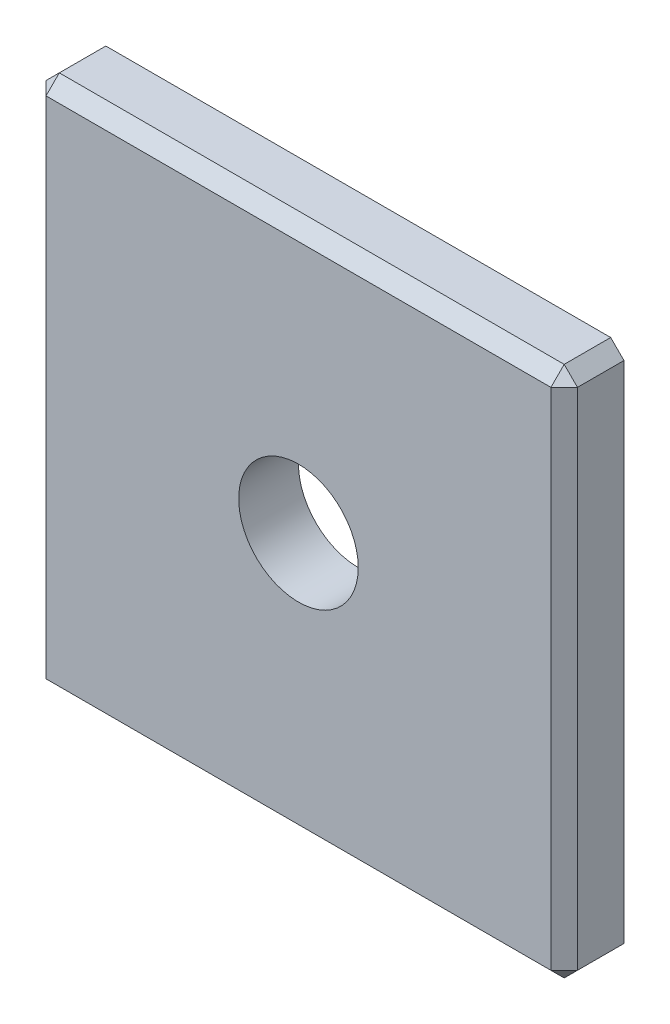
ISO-10303-21;
HEADER;
FILE_DESCRIPTION(('STEP AP214'),'2;1');
FILE_NAME('part.step','',(''),(''),'','','');
FILE_SCHEMA(('AUTOMOTIVE_DESIGN { 1 0 10303 214 1 1 1 1 }'));
ENDSEC;
DATA;
#1=APPLICATION_CONTEXT('core data for automotive mechanical design processes');
#2=APPLICATION_PROTOCOL_DEFINITION('international standard','automotive_design',2000,#1);
#3=PRODUCT_CONTEXT('',#1,'mechanical');
#4=PRODUCT('Part','Part','',(#3));
#5=PRODUCT_RELATED_PRODUCT_CATEGORY('part','',(#4));
#6=PRODUCT_DEFINITION_FORMATION('','',#4);
#7=PRODUCT_DEFINITION_CONTEXT('part definition',#1,'design');
#8=PRODUCT_DEFINITION('design','',#6,#7);
#9=PRODUCT_DEFINITION_SHAPE('','',#8);
#10=(LENGTH_UNIT() NAMED_UNIT(*) SI_UNIT(.MILLI.,.METRE.));
#11=(NAMED_UNIT(*) PLANE_ANGLE_UNIT() SI_UNIT($,.RADIAN.));
#12=(NAMED_UNIT(*) SI_UNIT($,.STERADIAN.) SOLID_ANGLE_UNIT());
#13=UNCERTAINTY_MEASURE_WITH_UNIT(LENGTH_MEASURE(1.E-05),#10,'distance_accuracy_value','');
#14=(GEOMETRIC_REPRESENTATION_CONTEXT(3) GLOBAL_UNCERTAINTY_ASSIGNED_CONTEXT((#13)) GLOBAL_UNIT_ASSIGNED_CONTEXT((#10,
#11,#12)) REPRESENTATION_CONTEXT('',''));
#15=CARTESIAN_POINT('',(0.,0.,0.));
#16=DIRECTION('',(0.,0.,1.));
#17=DIRECTION('',(1.,0.,0.));
#18=AXIS2_PLACEMENT_3D('',#15,#16,#17);
#19=CARTESIAN_POINT('',(0.,0.,4.5));
#20=DIRECTION('',(0.,0.,-1.));
#21=DIRECTION('',(-1.,0.,0.));
#22=AXIS2_PLACEMENT_3D('',#19,#20,#21);
#23=PLANE('',#22);
#24=DIRECTION('',(0.,-1.,0.));
#25=VECTOR('',#24,1.);
#26=CARTESIAN_POINT('',(-19.,0.,4.5));
#27=LINE('',#26,#25);
#28=CARTESIAN_POINT('',(-19.,19.,4.5));
#29=VERTEX_POINT('',#28);
#30=CARTESIAN_POINT('',(-19.,-19.,4.5));
#31=VERTEX_POINT('',#30);
#32=EDGE_CURVE('E116',#29,#31,#27,.T.);
#33=ORIENTED_EDGE('',*,*,#32,.T.);
#34=DIRECTION('',(1.,0.,0.));
#35=VECTOR('',#34,1.);
#36=CARTESIAN_POINT('',(0.,-19.,4.5));
#37=LINE('',#36,#35);
#38=CARTESIAN_POINT('',(19.,-19.,4.5));
#39=VERTEX_POINT('',#38);
#40=EDGE_CURVE('E153',#31,#39,#37,.T.);
#41=ORIENTED_EDGE('',*,*,#40,.T.);
#42=DIRECTION('',(0.,1.,0.));
#43=VECTOR('',#42,1.);
#44=CARTESIAN_POINT('',(19.,0.,4.5));
#45=LINE('',#44,#43);
#46=CARTESIAN_POINT('',(19.,19.,4.5));
#47=VERTEX_POINT('',#46);
#48=EDGE_CURVE('E119',#39,#47,#45,.T.);
#49=ORIENTED_EDGE('',*,*,#48,.T.);
#50=DIRECTION('',(-1.,0.,0.));
#51=VECTOR('',#50,1.);
#52=CARTESIAN_POINT('',(0.,19.,4.5));
#53=LINE('',#52,#51);
#54=EDGE_CURVE('E111',#47,#29,#53,.T.);
#55=ORIENTED_EDGE('',*,*,#54,.T.);
#56=EDGE_LOOP('',(#33,#41,#49,#55));
#57=FACE_BOUND('',#56,.T.);
#58=CARTESIAN_POINT('',(0.,0.,4.5));
#59=DIRECTION('',(0.,0.,1.));
#60=DIRECTION('',(1.,0.,0.));
#61=AXIS2_PLACEMENT_3D('',#58,#59,#60);
#62=CIRCLE('',#61,4.5);
#63=CARTESIAN_POINT('',(4.5,0.,4.5));
#64=VERTEX_POINT('',#63);
#65=EDGE_CURVE('E241',#64,#64,#62,.T.);
#66=ORIENTED_EDGE('',*,*,#65,.F.);
#67=EDGE_LOOP('',(#66));
#68=FACE_BOUND('',#67,.T.);
#69=ADVANCED_FACE('F35',(#57,#68),#23,.F.);
#70=CARTESIAN_POINT('',(0.,0.,0.));
#71=DIRECTION('',(0.,0.,-1.));
#72=DIRECTION('',(-1.,0.,0.));
#73=AXIS2_PLACEMENT_3D('',#70,#71,#72);
#74=PLANE('',#73);
#75=DIRECTION('',(0.,1.,0.));
#76=VECTOR('',#75,1.);
#77=CARTESIAN_POINT('',(20.,-20.,0.));
#78=LINE('',#77,#76);
#79=CARTESIAN_POINT('',(20.,-19.,0.));
#80=VERTEX_POINT('',#79);
#81=CARTESIAN_POINT('',(20.,19.,0.));
#82=VERTEX_POINT('',#81);
#83=EDGE_CURVE('E226',#80,#82,#78,.T.);
#84=ORIENTED_EDGE('',*,*,#83,.F.);
#85=DIRECTION('',(0.707106781186545,0.70710678118655,0.));
#86=VECTOR('',#85,1.);
#87=CARTESIAN_POINT('',(19.5000000000001,-19.4999999999999,0.));
#88=LINE('',#87,#86);
#89=CARTESIAN_POINT('',(19.,-20.,0.));
#90=VERTEX_POINT('',#89);
#91=EDGE_CURVE('E174',#80,#90,#88,.F.);
#92=ORIENTED_EDGE('',*,*,#91,.T.);
#93=DIRECTION('',(1.,0.,0.));
#94=VECTOR('',#93,1.);
#95=CARTESIAN_POINT('',(-20.,-20.,0.));
#96=LINE('',#95,#94);
#97=CARTESIAN_POINT('',(-19.,-20.,0.));
#98=VERTEX_POINT('',#97);
#99=EDGE_CURVE('E145',#98,#90,#96,.T.);
#100=ORIENTED_EDGE('',*,*,#99,.F.);
#101=DIRECTION('',(0.707106781186545,-0.70710678118655,0.));
#102=VECTOR('',#101,1.);
#103=CARTESIAN_POINT('',(-19.5000000000001,-19.4999999999999,0.));
#104=LINE('',#103,#102);
#105=CARTESIAN_POINT('',(-20.,-19.,0.));
#106=VERTEX_POINT('',#105);
#107=EDGE_CURVE('E168',#98,#106,#104,.F.);
#108=ORIENTED_EDGE('',*,*,#107,.T.);
#109=DIRECTION('',(0.,-1.,0.));
#110=VECTOR('',#109,1.);
#111=CARTESIAN_POINT('',(-20.,-20.,0.));
#112=LINE('',#111,#110);
#113=CARTESIAN_POINT('',(-20.,19.,0.));
#114=VERTEX_POINT('',#113);
#115=EDGE_CURVE('E148',#114,#106,#112,.T.);
#116=ORIENTED_EDGE('',*,*,#115,.F.);
#117=DIRECTION('',(-0.707106781186545,-0.70710678118655,0.));
#118=VECTOR('',#117,1.);
#119=CARTESIAN_POINT('',(-19.5000000000001,19.4999999999999,0.));
#120=LINE('',#119,#118);
#121=CARTESIAN_POINT('',(-19.,20.,0.));
#122=VERTEX_POINT('',#121);
#123=EDGE_CURVE('E170',#114,#122,#120,.F.);
#124=ORIENTED_EDGE('',*,*,#123,.T.);
#125=DIRECTION('',(-1.,0.,0.));
#126=VECTOR('',#125,1.);
#127=CARTESIAN_POINT('',(-20.,20.,0.));
#128=LINE('',#127,#126);
#129=CARTESIAN_POINT('',(19.,20.,0.));
#130=VERTEX_POINT('',#129);
#131=EDGE_CURVE('E236',#130,#122,#128,.T.);
#132=ORIENTED_EDGE('',*,*,#131,.F.);
#133=DIRECTION('',(-0.707106781186545,0.70710678118655,0.));
#134=VECTOR('',#133,1.);
#135=CARTESIAN_POINT('',(19.5000000000001,19.4999999999999,0.));
#136=LINE('',#135,#134);
#137=EDGE_CURVE('E172',#130,#82,#136,.F.);
#138=ORIENTED_EDGE('',*,*,#137,.T.);
#139=EDGE_LOOP('',(#84,#92,#100,#108,#116,#124,#132,#138));
#140=FACE_BOUND('',#139,.T.);
#141=CARTESIAN_POINT('',(0.,0.,0.));
#142=DIRECTION('',(0.,0.,1.));
#143=DIRECTION('',(1.,0.,0.));
#144=AXIS2_PLACEMENT_3D('',#141,#142,#143);
#145=CIRCLE('',#144,4.5);
#146=CARTESIAN_POINT('',(4.5,0.,0.));
#147=VERTEX_POINT('',#146);
#148=EDGE_CURVE('E242',#147,#147,#145,.T.);
#149=ORIENTED_EDGE('',*,*,#148,.T.);
#150=EDGE_LOOP('',(#149));
#151=FACE_BOUND('',#150,.T.);
#152=ADVANCED_FACE('F223',(#140,#151),#74,.T.);
#153=CARTESIAN_POINT('',(20.,-20.,4.5));
#154=DIRECTION('',(-1.,0.,0.));
#155=DIRECTION('',(0.,0.,1.));
#156=AXIS2_PLACEMENT_3D('',#153,#154,#155);
#157=PLANE('',#156);
#158=DIRECTION('',(0.,-1.,0.));
#159=VECTOR('',#158,1.);
#160=CARTESIAN_POINT('',(20.,-20.,3.49999999999999));
#161=LINE('',#160,#159);
#162=CARTESIAN_POINT('',(20.,19.,3.49999999999999));
#163=VERTEX_POINT('',#162);
#164=CARTESIAN_POINT('',(20.,-19.,3.49999999999999));
#165=VERTEX_POINT('',#164);
#166=EDGE_CURVE('E164',#163,#165,#161,.T.);
#167=ORIENTED_EDGE('',*,*,#166,.T.);
#168=DIRECTION('',(0.,0.,-1.));
#169=VECTOR('',#168,1.);
#170=CARTESIAN_POINT('',(20.,-19.,4.5));
#171=LINE('',#170,#169);
#172=EDGE_CURVE('E166',#165,#80,#171,.T.);
#173=ORIENTED_EDGE('',*,*,#172,.T.);
#174=ORIENTED_EDGE('',*,*,#83,.T.);
#175=DIRECTION('',(0.,0.,1.));
#176=VECTOR('',#175,1.);
#177=CARTESIAN_POINT('',(20.,19.,4.5));
#178=LINE('',#177,#176);
#179=EDGE_CURVE('E162',#82,#163,#178,.T.);
#180=ORIENTED_EDGE('',*,*,#179,.T.);
#181=EDGE_LOOP('',(#167,#173,#174,#180));
#182=FACE_BOUND('',#181,.T.);
#183=ADVANCED_FACE('F211',(#182),#157,.F.);
#184=CARTESIAN_POINT('',(-20.,20.,4.5));
#185=DIRECTION('',(0.,-1.,0.));
#186=DIRECTION('',(0.,0.,-1.));
#187=AXIS2_PLACEMENT_3D('',#184,#185,#186);
#188=PLANE('',#187);
#189=DIRECTION('',(1.,0.,0.));
#190=VECTOR('',#189,1.);
#191=CARTESIAN_POINT('',(-20.,20.,3.49999999999999));
#192=LINE('',#191,#190);
#193=CARTESIAN_POINT('',(-19.,20.,3.49999999999999));
#194=VERTEX_POINT('',#193);
#195=CARTESIAN_POINT('',(19.,20.,3.49999999999999));
#196=VERTEX_POINT('',#195);
#197=EDGE_CURVE('E129',#194,#196,#192,.T.);
#198=ORIENTED_EDGE('',*,*,#197,.T.);
#199=DIRECTION('',(0.,0.,-1.));
#200=VECTOR('',#199,1.);
#201=CARTESIAN_POINT('',(19.,20.,4.5));
#202=LINE('',#201,#200);
#203=EDGE_CURVE('E179',#196,#130,#202,.T.);
#204=ORIENTED_EDGE('',*,*,#203,.T.);
#205=ORIENTED_EDGE('',*,*,#131,.T.);
#206=DIRECTION('',(0.,0.,1.));
#207=VECTOR('',#206,1.);
#208=CARTESIAN_POINT('',(-19.,20.,4.5));
#209=LINE('',#208,#207);
#210=EDGE_CURVE('E176',#122,#194,#209,.T.);
#211=ORIENTED_EDGE('',*,*,#210,.T.);
#212=EDGE_LOOP('',(#198,#204,#205,#211));
#213=FACE_BOUND('',#212,.T.);
#214=ADVANCED_FACE('F262',(#213),#188,.F.);
#215=CARTESIAN_POINT('',(-20.,-20.,4.5));
#216=DIRECTION('',(1.,0.,0.));
#217=DIRECTION('',(0.,0.,-1.));
#218=AXIS2_PLACEMENT_3D('',#215,#216,#217);
#219=PLANE('',#218);
#220=DIRECTION('',(0.,1.,0.));
#221=VECTOR('',#220,1.);
#222=CARTESIAN_POINT('',(-20.,-20.,3.49999999999999));
#223=LINE('',#222,#221);
#224=CARTESIAN_POINT('',(-20.,-19.,3.49999999999999));
#225=VERTEX_POINT('',#224);
#226=CARTESIAN_POINT('',(-20.,19.,3.49999999999999));
#227=VERTEX_POINT('',#226);
#228=EDGE_CURVE('E45',#225,#227,#223,.T.);
#229=ORIENTED_EDGE('',*,*,#228,.T.);
#230=DIRECTION('',(0.,0.,-1.));
#231=VECTOR('',#230,1.);
#232=CARTESIAN_POINT('',(-20.,19.,4.5));
#233=LINE('',#232,#231);
#234=EDGE_CURVE('E11',#227,#114,#233,.T.);
#235=ORIENTED_EDGE('',*,*,#234,.T.);
#236=ORIENTED_EDGE('',*,*,#115,.T.);
#237=DIRECTION('',(0.,0.,1.));
#238=VECTOR('',#237,1.);
#239=CARTESIAN_POINT('',(-20.,-19.,4.5));
#240=LINE('',#239,#238);
#241=EDGE_CURVE('E56',#106,#225,#240,.T.);
#242=ORIENTED_EDGE('',*,*,#241,.T.);
#243=EDGE_LOOP('',(#229,#235,#236,#242));
#244=FACE_BOUND('',#243,.T.);
#245=ADVANCED_FACE('F235',(#244),#219,.F.);
#246=CARTESIAN_POINT('',(-20.,-20.,4.5));
#247=DIRECTION('',(0.,1.,0.));
#248=DIRECTION('',(0.,0.,1.));
#249=AXIS2_PLACEMENT_3D('',#246,#247,#248);
#250=PLANE('',#249);
#251=ORIENTED_EDGE('',*,*,#99,.T.);
#252=DIRECTION('',(0.,0.,1.));
#253=VECTOR('',#252,1.);
#254=CARTESIAN_POINT('',(19.,-20.,4.5));
#255=LINE('',#254,#253);
#256=CARTESIAN_POINT('',(19.,-20.,3.5));
#257=VERTEX_POINT('',#256);
#258=EDGE_CURVE('E160',#90,#257,#255,.T.);
#259=ORIENTED_EDGE('',*,*,#258,.T.);
#260=DIRECTION('',(-1.,0.,0.));
#261=VECTOR('',#260,1.);
#262=CARTESIAN_POINT('',(-20.,-20.,3.5));
#263=LINE('',#262,#261);
#264=CARTESIAN_POINT('',(-19.,-20.,3.5));
#265=VERTEX_POINT('',#264);
#266=EDGE_CURVE('E157',#257,#265,#263,.T.);
#267=ORIENTED_EDGE('',*,*,#266,.T.);
#268=DIRECTION('',(0.,0.,-1.));
#269=VECTOR('',#268,1.);
#270=CARTESIAN_POINT('',(-19.,-20.,4.5));
#271=LINE('',#270,#269);
#272=EDGE_CURVE('E155',#265,#98,#271,.T.);
#273=ORIENTED_EDGE('',*,*,#272,.T.);
#274=EDGE_LOOP('',(#251,#259,#267,#273));
#275=FACE_BOUND('',#274,.T.);
#276=ADVANCED_FACE('F228',(#275),#250,.F.);
#277=CARTESIAN_POINT('',(0.,0.,4.5));
#278=DIRECTION('',(0.,0.,-1.));
#279=DIRECTION('',(-1.,0.,0.));
#280=AXIS2_PLACEMENT_3D('',#277,#278,#279);
#281=CYLINDRICAL_SURFACE('',#280,4.5);
#282=ORIENTED_EDGE('',*,*,#65,.T.);
#283=EDGE_LOOP('',(#282));
#284=FACE_BOUND('',#283,.T.);
#285=ORIENTED_EDGE('',*,*,#148,.F.);
#286=EDGE_LOOP('',(#285));
#287=FACE_BOUND('',#286,.T.);
#288=ADVANCED_FACE('F248',(#284,#287),#281,.F.);
#289=CARTESIAN_POINT('',(-20.,19.,4.5));
#290=DIRECTION('',(0.70710678118655,-0.707106781186545,0.));
#291=DIRECTION('',(0.,0.,-1.));
#292=AXIS2_PLACEMENT_3D('',#289,#290,#291);
#293=PLANE('',#292);
#294=ORIENTED_EDGE('',*,*,#123,.F.);
#295=ORIENTED_EDGE('',*,*,#234,.F.);
#296=DIRECTION('',(0.707106781186545,0.70710678118655,0.));
#297=VECTOR('',#296,1.);
#298=CARTESIAN_POINT('',(-19.5,19.5,3.49999999999999));
#299=LINE('',#298,#297);
#300=EDGE_CURVE('E40',#194,#227,#299,.F.);
#301=ORIENTED_EDGE('',*,*,#300,.F.);
#302=ORIENTED_EDGE('',*,*,#210,.F.);
#303=EDGE_LOOP('',(#294,#295,#301,#302));
#304=FACE_BOUND('',#303,.T.);
#305=ADVANCED_FACE('F38',(#304),#293,.F.);
#306=CARTESIAN_POINT('',(0.,19.,4.5));
#307=DIRECTION('',(0.,-0.70710678118655,-0.707106781186545));
#308=DIRECTION('',(-1.,0.,0.));
#309=AXIS2_PLACEMENT_3D('',#306,#307,#308);
#310=PLANE('',#309);
#311=DIRECTION('',(0.,0.707106781186545,-0.70710678118655));
#312=VECTOR('',#311,1.);
#313=CARTESIAN_POINT('',(19.,19.,4.5));
#314=LINE('',#313,#312);
#315=EDGE_CURVE('E133',#196,#47,#314,.F.);
#316=ORIENTED_EDGE('',*,*,#315,.F.);
#317=ORIENTED_EDGE('',*,*,#197,.F.);
#318=DIRECTION('',(0.,-0.707106781186545,0.70710678118655));
#319=VECTOR('',#318,1.);
#320=CARTESIAN_POINT('',(-19.,19.,4.5));
#321=LINE('',#320,#319);
#322=EDGE_CURVE('E126',#29,#194,#321,.F.);
#323=ORIENTED_EDGE('',*,*,#322,.F.);
#324=ORIENTED_EDGE('',*,*,#54,.F.);
#325=EDGE_LOOP('',(#316,#317,#323,#324));
#326=FACE_BOUND('',#325,.T.);
#327=ADVANCED_FACE('F128',(#326),#310,.F.);
#328=CARTESIAN_POINT('',(19.,20.,4.5));
#329=DIRECTION('',(-0.70710678118655,-0.707106781186545,0.));
#330=DIRECTION('',(0.,0.,-1.));
#331=AXIS2_PLACEMENT_3D('',#328,#329,#330);
#332=PLANE('',#331);
#333=ORIENTED_EDGE('',*,*,#137,.F.);
#334=ORIENTED_EDGE('',*,*,#203,.F.);
#335=DIRECTION('',(0.707106781186545,-0.70710678118655,0.));
#336=VECTOR('',#335,1.);
#337=CARTESIAN_POINT('',(19.5,19.5,3.49999999999999));
#338=LINE('',#337,#336);
#339=EDGE_CURVE('E138',#163,#196,#338,.F.);
#340=ORIENTED_EDGE('',*,*,#339,.F.);
#341=ORIENTED_EDGE('',*,*,#179,.F.);
#342=EDGE_LOOP('',(#333,#334,#340,#341));
#343=FACE_BOUND('',#342,.T.);
#344=ADVANCED_FACE('F320',(#343),#332,.F.);
#345=CARTESIAN_POINT('',(-19.,19.,4.5));
#346=DIRECTION('',(-0.57735026918963,0.577350269189626,0.577350269189622));
#347=DIRECTION('',(-0.707106781186545,-0.70710678118655,0.));
#348=AXIS2_PLACEMENT_3D('',#345,#346,#347);
#349=PLANE('',#348);
#350=ORIENTED_EDGE('',*,*,#322,.T.);
#351=ORIENTED_EDGE('',*,*,#300,.T.);
#352=DIRECTION('',(-0.707106781186545,0.,-0.70710678118655));
#353=VECTOR('',#352,1.);
#354=CARTESIAN_POINT('',(-19.,19.,4.5));
#355=LINE('',#354,#353);
#356=EDGE_CURVE('E135',#29,#227,#355,.T.);
#357=ORIENTED_EDGE('',*,*,#356,.F.);
#358=EDGE_LOOP('',(#350,#351,#357));
#359=FACE_BOUND('',#358,.T.);
#360=ADVANCED_FACE('F136',(#359),#349,.T.);
#361=CARTESIAN_POINT('',(19.,19.,4.5));
#362=DIRECTION('',(0.57735026918963,0.577350269189626,0.577350269189622));
#363=DIRECTION('',(-0.707106781186545,0.70710678118655,0.));
#364=AXIS2_PLACEMENT_3D('',#361,#362,#363);
#365=PLANE('',#364);
#366=ORIENTED_EDGE('',*,*,#339,.T.);
#367=ORIENTED_EDGE('',*,*,#315,.T.);
#368=DIRECTION('',(-0.707106781186545,0.,0.70710678118655));
#369=VECTOR('',#368,1.);
#370=CARTESIAN_POINT('',(19.,19.,4.5));
#371=LINE('',#370,#369);
#372=EDGE_CURVE('E139',#163,#47,#371,.T.);
#373=ORIENTED_EDGE('',*,*,#372,.F.);
#374=EDGE_LOOP('',(#366,#367,#373));
#375=FACE_BOUND('',#374,.T.);
#376=ADVANCED_FACE('F203',(#375),#365,.T.);
#377=CARTESIAN_POINT('',(-19.,-20.,4.5));
#378=DIRECTION('',(0.70710678118655,0.707106781186545,0.));
#379=DIRECTION('',(0.,0.,-1.));
#380=AXIS2_PLACEMENT_3D('',#377,#378,#379);
#381=PLANE('',#380);
#382=ORIENTED_EDGE('',*,*,#107,.F.);
#383=ORIENTED_EDGE('',*,*,#272,.F.);
#384=DIRECTION('',(-0.707106781186545,0.70710678118655,0.));
#385=VECTOR('',#384,1.);
#386=CARTESIAN_POINT('',(-19.,-20.,3.5));
#387=LINE('',#386,#385);
#388=EDGE_CURVE('E194',#225,#265,#387,.F.);
#389=ORIENTED_EDGE('',*,*,#388,.F.);
#390=ORIENTED_EDGE('',*,*,#241,.F.);
#391=EDGE_LOOP('',(#382,#383,#389,#390));
#392=FACE_BOUND('',#391,.T.);
#393=ADVANCED_FACE('F232',(#392),#381,.F.);
#394=CARTESIAN_POINT('',(-19.,0.,4.5));
#395=DIRECTION('',(0.70710678118655,0.,-0.707106781186545));
#396=DIRECTION('',(0.,-1.,0.));
#397=AXIS2_PLACEMENT_3D('',#394,#395,#396);
#398=PLANE('',#397);
#399=ORIENTED_EDGE('',*,*,#356,.T.);
#400=ORIENTED_EDGE('',*,*,#228,.F.);
#401=DIRECTION('',(0.707106781186545,0.,0.70710678118655));
#402=VECTOR('',#401,1.);
#403=CARTESIAN_POINT('',(-19.5,-19.,4.));
#404=LINE('',#403,#402);
#405=EDGE_CURVE('E143',#31,#225,#404,.F.);
#406=ORIENTED_EDGE('',*,*,#405,.F.);
#407=ORIENTED_EDGE('',*,*,#32,.F.);
#408=EDGE_LOOP('',(#399,#400,#406,#407));
#409=FACE_BOUND('',#408,.T.);
#410=ADVANCED_FACE('F141',(#409),#398,.F.);
#411=CARTESIAN_POINT('',(19.,0.,4.5));
#412=DIRECTION('',(-0.70710678118655,0.,-0.707106781186545));
#413=DIRECTION('',(0.,1.,0.));
#414=AXIS2_PLACEMENT_3D('',#411,#412,#413);
#415=PLANE('',#414);
#416=ORIENTED_EDGE('',*,*,#372,.T.);
#417=ORIENTED_EDGE('',*,*,#48,.F.);
#418=DIRECTION('',(0.707106781186545,0.,-0.70710678118655));
#419=VECTOR('',#418,1.);
#420=CARTESIAN_POINT('',(19.,-19.,4.5));
#421=LINE('',#420,#419);
#422=EDGE_CURVE('E190',#165,#39,#421,.F.);
#423=ORIENTED_EDGE('',*,*,#422,.F.);
#424=ORIENTED_EDGE('',*,*,#166,.F.);
#425=EDGE_LOOP('',(#416,#417,#423,#424));
#426=FACE_BOUND('',#425,.T.);
#427=ADVANCED_FACE('F207',(#426),#415,.F.);
#428=CARTESIAN_POINT('',(20.,-19.,4.5));
#429=DIRECTION('',(-0.70710678118655,0.707106781186545,0.));
#430=DIRECTION('',(0.,0.,-1.));
#431=AXIS2_PLACEMENT_3D('',#428,#429,#430);
#432=PLANE('',#431);
#433=ORIENTED_EDGE('',*,*,#91,.F.);
#434=ORIENTED_EDGE('',*,*,#172,.F.);
#435=DIRECTION('',(-0.707106781186545,-0.70710678118655,0.));
#436=VECTOR('',#435,1.);
#437=CARTESIAN_POINT('',(19.5,-19.5,3.5));
#438=LINE('',#437,#436);
#439=EDGE_CURVE('E187',#257,#165,#438,.F.);
#440=ORIENTED_EDGE('',*,*,#439,.F.);
#441=ORIENTED_EDGE('',*,*,#258,.F.);
#442=EDGE_LOOP('',(#433,#434,#440,#441));
#443=FACE_BOUND('',#442,.T.);
#444=ADVANCED_FACE('F218',(#443),#432,.F.);
#445=CARTESIAN_POINT('',(-19.,-20.,3.5));
#446=DIRECTION('',(-0.57735026918963,-0.577350269189622,0.577350269189626));
#447=DIRECTION('',(0.707106781186545,0.,0.70710678118655));
#448=AXIS2_PLACEMENT_3D('',#445,#446,#447);
#449=PLANE('',#448);
#450=ORIENTED_EDGE('',*,*,#405,.T.);
#451=ORIENTED_EDGE('',*,*,#388,.T.);
#452=DIRECTION('',(0.,-0.70710678118655,-0.707106781186545));
#453=VECTOR('',#452,1.);
#454=CARTESIAN_POINT('',(-19.,-20.,3.5));
#455=LINE('',#454,#453);
#456=EDGE_CURVE('E185',#31,#265,#455,.T.);
#457=ORIENTED_EDGE('',*,*,#456,.F.);
#458=EDGE_LOOP('',(#450,#451,#457));
#459=FACE_BOUND('',#458,.T.);
#460=ADVANCED_FACE('F282',(#459),#449,.T.);
#461=CARTESIAN_POINT('',(19.,-19.,4.5));
#462=DIRECTION('',(0.57735026918963,-0.577350269189622,0.577350269189626));
#463=DIRECTION('',(0.707106781186545,0.,-0.70710678118655));
#464=AXIS2_PLACEMENT_3D('',#461,#462,#463);
#465=PLANE('',#464);
#466=ORIENTED_EDGE('',*,*,#439,.T.);
#467=ORIENTED_EDGE('',*,*,#422,.T.);
#468=DIRECTION('',(0.,0.70710678118655,0.707106781186545));
#469=VECTOR('',#468,1.);
#470=CARTESIAN_POINT('',(19.,-19.,4.5));
#471=LINE('',#470,#469);
#472=EDGE_CURVE('E183',#257,#39,#471,.T.);
#473=ORIENTED_EDGE('',*,*,#472,.F.);
#474=EDGE_LOOP('',(#466,#467,#473));
#475=FACE_BOUND('',#474,.T.);
#476=ADVANCED_FACE('F275',(#475),#465,.T.);
#477=CARTESIAN_POINT('',(0.,-19.,4.5));
#478=DIRECTION('',(0.,0.707106781186545,-0.70710678118655));
#479=DIRECTION('',(1.,0.,0.));
#480=AXIS2_PLACEMENT_3D('',#477,#478,#479);
#481=PLANE('',#480);
#482=ORIENTED_EDGE('',*,*,#456,.T.);
#483=ORIENTED_EDGE('',*,*,#266,.F.);
#484=ORIENTED_EDGE('',*,*,#472,.T.);
#485=ORIENTED_EDGE('',*,*,#40,.F.);
#486=EDGE_LOOP('',(#482,#483,#484,#485));
#487=FACE_BOUND('',#486,.T.);
#488=ADVANCED_FACE('F269',(#487),#481,.F.);
#489=CLOSED_SHELL('',(#69,#152,#183,#214,#245,#276,#288,#305,#327,#344,#360,#376,#393,#410,#427,
#444,#460,#476,#488));
#490=MANIFOLD_SOLID_BREP('B2',#489);
#491=ADVANCED_BREP_SHAPE_REPRESENTATION('',(#18,#490),#14);
#492=SHAPE_DEFINITION_REPRESENTATION(#9,#491);
ENDSEC;
END-ISO-10303-21;
